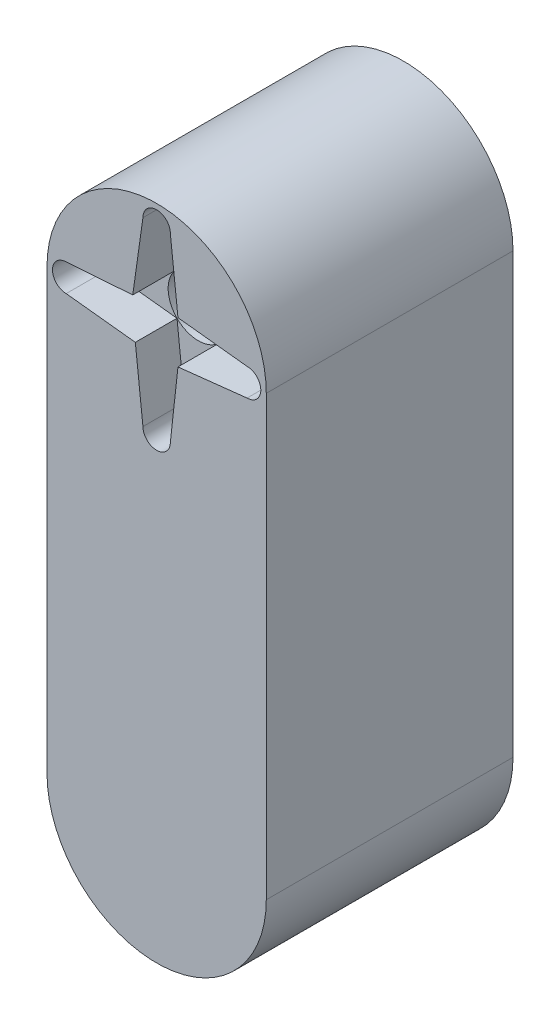
ISO-10303-21;
HEADER;
FILE_DESCRIPTION(('STEP AP214'),'2;1');
FILE_NAME('part.step','',(''),(''),'','','');
FILE_SCHEMA(('AUTOMOTIVE_DESIGN { 1 0 10303 214 1 1 1 1 }'));
ENDSEC;
DATA;
#1=APPLICATION_CONTEXT('core data for automotive mechanical design processes');
#2=APPLICATION_PROTOCOL_DEFINITION('international standard','automotive_design',2000,#1);
#3=PRODUCT_CONTEXT('',#1,'mechanical');
#4=PRODUCT('Part','Part','',(#3));
#5=PRODUCT_RELATED_PRODUCT_CATEGORY('part','',(#4));
#6=PRODUCT_DEFINITION_FORMATION('','',#4);
#7=PRODUCT_DEFINITION_CONTEXT('part definition',#1,'design');
#8=PRODUCT_DEFINITION('design','',#6,#7);
#9=PRODUCT_DEFINITION_SHAPE('','',#8);
#10=(LENGTH_UNIT() NAMED_UNIT(*) SI_UNIT(.MILLI.,.METRE.));
#11=(NAMED_UNIT(*) PLANE_ANGLE_UNIT() SI_UNIT($,.RADIAN.));
#12=(NAMED_UNIT(*) SI_UNIT($,.STERADIAN.) SOLID_ANGLE_UNIT());
#13=UNCERTAINTY_MEASURE_WITH_UNIT(LENGTH_MEASURE(1.E-05),#10,'distance_accuracy_value','');
#14=(GEOMETRIC_REPRESENTATION_CONTEXT(3) GLOBAL_UNCERTAINTY_ASSIGNED_CONTEXT((#13)) GLOBAL_UNIT_ASSIGNED_CONTEXT((#10,
#11,#12)) REPRESENTATION_CONTEXT('',''));
#15=CARTESIAN_POINT('',(0.,0.,0.));
#16=DIRECTION('',(0.,0.,1.));
#17=DIRECTION('',(1.,0.,0.));
#18=AXIS2_PLACEMENT_3D('',#15,#16,#17);
#19=CARTESIAN_POINT('',(10.,-50.,40.));
#20=DIRECTION('',(0.,-1.,0.));
#21=DIRECTION('',(0.,0.,-1.));
#22=AXIS2_PLACEMENT_3D('',#19,#20,#21);
#23=PLANE('',#22);
#24=DIRECTION('',(1.,0.,0.));
#25=VECTOR('',#24,1.);
#26=CARTESIAN_POINT('',(-10.,-50.,27.));
#27=LINE('',#26,#25);
#28=CARTESIAN_POINT('',(-10.,-50.,27.));
#29=VERTEX_POINT('',#28);
#30=CARTESIAN_POINT('',(10.,-50.,27.));
#31=VERTEX_POINT('',#30);
#32=EDGE_CURVE('E699',#29,#31,#27,.T.);
#33=ORIENTED_EDGE('',*,*,#32,.T.);
#34=DIRECTION('',(0.,0.,-1.));
#35=VECTOR('',#34,1.);
#36=CARTESIAN_POINT('',(10.,-50.,40.));
#37=LINE('',#36,#35);
#38=CARTESIAN_POINT('',(10.,-50.,12.));
#39=VERTEX_POINT('',#38);
#40=EDGE_CURVE('E269',#31,#39,#37,.T.);
#41=ORIENTED_EDGE('',*,*,#40,.T.);
#42=DIRECTION('',(1.,0.,0.));
#43=VECTOR('',#42,1.);
#44=CARTESIAN_POINT('',(-10.,-50.,12.));
#45=LINE('',#44,#43);
#46=CARTESIAN_POINT('',(-10.,-50.,12.));
#47=VERTEX_POINT('',#46);
#48=EDGE_CURVE('E640',#47,#39,#45,.T.);
#49=ORIENTED_EDGE('',*,*,#48,.F.);
#50=DIRECTION('',(0.,0.,-1.));
#51=VECTOR('',#50,1.);
#52=CARTESIAN_POINT('',(-10.,-50.,40.));
#53=LINE('',#52,#51);
#54=EDGE_CURVE('E256',#29,#47,#53,.T.);
#55=ORIENTED_EDGE('',*,*,#54,.F.);
#56=EDGE_LOOP('',(#33,#41,#49,#55));
#57=FACE_BOUND('',#56,.T.);
#58=ADVANCED_FACE('F45',(#57),#23,.F.);
#59=CARTESIAN_POINT('',(-16.5,40.,37.4));
#60=DIRECTION('',(0.,0.,1.));
#61=DIRECTION('',(1.,0.,0.));
#62=AXIS2_PLACEMENT_3D('',#59,#60,#61);
#63=PLANE('',#62);
#64=CARTESIAN_POINT('',(0.,40.,37.4));
#65=DIRECTION('',(0.,0.,1.));
#66=DIRECTION('',(1.,0.,0.));
#67=AXIS2_PLACEMENT_3D('',#64,#65,#66);
#68=CIRCLE('',#67,5.5);
#69=CARTESIAN_POINT('',(3.88908729652601,43.889087296526,37.4));
#70=VERTEX_POINT('',#69);
#71=CARTESIAN_POINT('',(-4.35596230646489,43.3579148864522,37.4));
#72=VERTEX_POINT('',#71);
#73=EDGE_CURVE('E11',#70,#72,#68,.T.);
#74=ORIENTED_EDGE('',*,*,#73,.F.);
#75=DIRECTION('',(-0.109487424700767,0.993988180931943,0.));
#76=VECTOR('',#75,1.);
#77=CARTESIAN_POINT('',(2.5,56.5,37.4));
#78=LINE('',#77,#76);
#79=CARTESIAN_POINT('',(2.5,56.5,37.4));
#80=VERTEX_POINT('',#79);
#81=EDGE_CURVE('E312',#70,#80,#78,.T.);
#82=ORIENTED_EDGE('',*,*,#81,.T.);
#83=CARTESIAN_POINT('',(0.,56.5,37.4));
#84=DIRECTION('',(0.,0.,1.));
#85=DIRECTION('',(1.,0.,0.));
#86=AXIS2_PLACEMENT_3D('',#83,#84,#85);
#87=CIRCLE('',#86,2.5);
#88=CARTESIAN_POINT('',(-2.5,56.5,37.4));
#89=VERTEX_POINT('',#88);
#90=EDGE_CURVE('E316',#80,#89,#87,.T.);
#91=ORIENTED_EDGE('',*,*,#90,.T.);
#92=DIRECTION('',(-0.139835273763505,-0.990174780637987,0.));
#93=VECTOR('',#92,1.);
#94=CARTESIAN_POINT('',(-2.5,56.5,37.4));
#95=LINE('',#94,#93);
#96=EDGE_CURVE('E320',#89,#72,#95,.T.);
#97=ORIENTED_EDGE('',*,*,#96,.T.);
#98=EDGE_LOOP('',(#74,#82,#91,#97));
#99=FACE_BOUND('',#98,.T.);
#100=ADVANCED_FACE('F485',(#99),#63,.T.);
#101=CARTESIAN_POINT('',(-3.88908729652601,36.110912703474,37.4));
#102=VERTEX_POINT('',#101);
#103=EDGE_CURVE('E55',#72,#102,#68,.T.);
#104=ORIENTED_EDGE('',*,*,#103,.F.);
#105=DIRECTION('',(-0.997513947318562,-0.0704693188908521,0.));
#106=VECTOR('',#105,1.);
#107=CARTESIAN_POINT('',(-16.5,42.5,37.4));
#108=LINE('',#107,#106);
#109=CARTESIAN_POINT('',(-16.5,42.5,37.4));
#110=VERTEX_POINT('',#109);
#111=EDGE_CURVE('E324',#72,#110,#108,.T.);
#112=ORIENTED_EDGE('',*,*,#111,.T.);
#113=CARTESIAN_POINT('',(-16.5,40.,37.4));
#114=DIRECTION('',(0.,0.,1.));
#115=DIRECTION('',(1.,0.,0.));
#116=AXIS2_PLACEMENT_3D('',#113,#114,#115);
#117=CIRCLE('',#116,2.5);
#118=CARTESIAN_POINT('',(-16.5,37.5,37.4));
#119=VERTEX_POINT('',#118);
#120=EDGE_CURVE('E279',#110,#119,#117,.T.);
#121=ORIENTED_EDGE('',*,*,#120,.T.);
#122=DIRECTION('',(0.993988180931943,-0.109487424700767,0.));
#123=VECTOR('',#122,1.);
#124=CARTESIAN_POINT('',(-16.5,37.5,37.4));
#125=LINE('',#124,#123);
#126=EDGE_CURVE('E283',#119,#102,#125,.T.);
#127=ORIENTED_EDGE('',*,*,#126,.T.);
#128=EDGE_LOOP('',(#104,#112,#121,#127));
#129=FACE_BOUND('',#128,.T.);
#130=ADVANCED_FACE('F493',(#129),#63,.T.);
#131=CARTESIAN_POINT('',(3.88908729652601,36.110912703474,37.4));
#132=VERTEX_POINT('',#131);
#133=EDGE_CURVE('E597',#102,#132,#68,.T.);
#134=ORIENTED_EDGE('',*,*,#133,.F.);
#135=DIRECTION('',(0.109487424700768,-0.993988180931943,0.));
#136=VECTOR('',#135,1.);
#137=CARTESIAN_POINT('',(-2.5,23.5,37.4));
#138=LINE('',#137,#136);
#139=CARTESIAN_POINT('',(-2.5,23.5,37.4));
#140=VERTEX_POINT('',#139);
#141=EDGE_CURVE('E288',#102,#140,#138,.T.);
#142=ORIENTED_EDGE('',*,*,#141,.T.);
#143=CARTESIAN_POINT('',(0.,23.5,37.4));
#144=DIRECTION('',(0.,0.,1.));
#145=DIRECTION('',(1.,0.,0.));
#146=AXIS2_PLACEMENT_3D('',#143,#144,#145);
#147=CIRCLE('',#146,2.5);
#148=CARTESIAN_POINT('',(2.5,23.5,37.4));
#149=VERTEX_POINT('',#148);
#150=EDGE_CURVE('E292',#140,#149,#147,.T.);
#151=ORIENTED_EDGE('',*,*,#150,.T.);
#152=DIRECTION('',(0.109487424700767,0.993988180931943,0.));
#153=VECTOR('',#152,1.);
#154=CARTESIAN_POINT('',(3.88908729652601,36.110912703474,37.4));
#155=LINE('',#154,#153);
#156=EDGE_CURVE('E296',#149,#132,#155,.T.);
#157=ORIENTED_EDGE('',*,*,#156,.T.);
#158=EDGE_LOOP('',(#134,#142,#151,#157));
#159=FACE_BOUND('',#158,.T.);
#160=ADVANCED_FACE('F520',(#159),#63,.T.);
#161=CARTESIAN_POINT('',(0.,-40.,45.));
#162=DIRECTION('',(0.,0.,-1.));
#163=DIRECTION('',(-1.,0.,0.));
#164=AXIS2_PLACEMENT_3D('',#161,#162,#163);
#165=CYLINDRICAL_SURFACE('',#164,20.);
#166=DIRECTION('',(0.,0.,-1.));
#167=VECTOR('',#166,1.);
#168=CARTESIAN_POINT('',(-10.,-57.3205080756888,45.));
#169=LINE('',#168,#167);
#170=CARTESIAN_POINT('',(-10.,-57.3205080756888,27.));
#171=VERTEX_POINT('',#170);
#172=CARTESIAN_POINT('',(-10.,-57.3205080756888,39.));
#173=VERTEX_POINT('',#172);
#174=EDGE_CURVE('E657',#171,#173,#169,.F.);
#175=ORIENTED_EDGE('',*,*,#174,.T.);
#176=CARTESIAN_POINT('',(0.,-40.,39.));
#177=DIRECTION('',(0.,0.,1.));
#178=DIRECTION('',(1.,0.,0.));
#179=AXIS2_PLACEMENT_3D('',#176,#177,#178);
#180=CIRCLE('',#179,20.);
#181=CARTESIAN_POINT('',(10.,-57.3205080756888,39.));
#182=VERTEX_POINT('',#181);
#183=EDGE_CURVE('E233',#173,#182,#180,.T.);
#184=ORIENTED_EDGE('',*,*,#183,.T.);
#185=DIRECTION('',(0.,0.,-1.));
#186=VECTOR('',#185,1.);
#187=CARTESIAN_POINT('',(10.,-57.3205080756888,45.));
#188=LINE('',#187,#186);
#189=CARTESIAN_POINT('',(10.,-57.3205080756888,27.));
#190=VERTEX_POINT('',#189);
#191=EDGE_CURVE('E690',#182,#190,#188,.T.);
#192=ORIENTED_EDGE('',*,*,#191,.T.);
#193=CARTESIAN_POINT('',(0.,-40.,27.));
#194=DIRECTION('',(0.,0.,1.));
#195=DIRECTION('',(1.,0.,0.));
#196=AXIS2_PLACEMENT_3D('',#193,#194,#195);
#197=CIRCLE('',#196,20.);
#198=EDGE_CURVE('E692',#171,#190,#197,.T.);
#199=ORIENTED_EDGE('',*,*,#198,.F.);
#200=EDGE_LOOP('',(#175,#184,#192,#199));
#201=FACE_BOUND('',#200,.T.);
#202=CARTESIAN_POINT('',(0.,-40.,45.));
#203=DIRECTION('',(0.,0.,1.));
#204=DIRECTION('',(1.,0.,0.));
#205=AXIS2_PLACEMENT_3D('',#202,#203,#204);
#206=CIRCLE('',#205,20.);
#207=CARTESIAN_POINT('',(-20.,-40.,45.));
#208=VERTEX_POINT('',#207);
#209=CARTESIAN_POINT('',(20.,-40.,45.));
#210=VERTEX_POINT('',#209);
#211=EDGE_CURVE('E447',#208,#210,#206,.T.);
#212=ORIENTED_EDGE('',*,*,#211,.F.);
#213=DIRECTION('',(0.,0.,1.));
#214=VECTOR('',#213,1.);
#215=CARTESIAN_POINT('',(-20.,-40.,0.));
#216=LINE('',#215,#214);
#217=CARTESIAN_POINT('',(-20.,-40.,0.));
#218=VERTEX_POINT('',#217);
#219=EDGE_CURVE('E432',#218,#208,#216,.T.);
#220=ORIENTED_EDGE('',*,*,#219,.F.);
#221=CARTESIAN_POINT('',(0.,-40.,0.));
#222=DIRECTION('',(0.,0.,1.));
#223=DIRECTION('',(1.,0.,0.));
#224=AXIS2_PLACEMENT_3D('',#221,#222,#223);
#225=CIRCLE('',#224,20.);
#226=CARTESIAN_POINT('',(20.,-40.,0.));
#227=VERTEX_POINT('',#226);
#228=EDGE_CURVE('E436',#218,#227,#225,.T.);
#229=ORIENTED_EDGE('',*,*,#228,.T.);
#230=DIRECTION('',(0.,0.,1.));
#231=VECTOR('',#230,1.);
#232=CARTESIAN_POINT('',(20.,-40.,0.));
#233=LINE('',#232,#231);
#234=EDGE_CURVE('E426',#227,#210,#233,.T.);
#235=ORIENTED_EDGE('',*,*,#234,.T.);
#236=EDGE_LOOP('',(#212,#220,#229,#235));
#237=FACE_BOUND('',#236,.T.);
#238=ADVANCED_FACE('F47',(#201,#237),#165,.T.);
#239=CARTESIAN_POINT('',(0.,-40.,45.));
#240=DIRECTION('',(0.,0.,1.));
#241=DIRECTION('',(1.,0.,0.));
#242=AXIS2_PLACEMENT_3D('',#239,#240,#241);
#243=PLANE('',#242);
#244=CARTESIAN_POINT('',(-16.5,40.,45.));
#245=DIRECTION('',(0.,0.,1.));
#246=DIRECTION('',(1.,0.,0.));
#247=AXIS2_PLACEMENT_3D('',#244,#245,#246);
#248=CIRCLE('',#247,2.5);
#249=CARTESIAN_POINT('',(-16.5,42.5,45.));
#250=VERTEX_POINT('',#249);
#251=CARTESIAN_POINT('',(-16.5,37.5,45.));
#252=VERTEX_POINT('',#251);
#253=EDGE_CURVE('E261',#250,#252,#248,.T.);
#254=ORIENTED_EDGE('',*,*,#253,.F.);
#255=DIRECTION('',(-0.997513947318562,-0.0704693188908521,0.));
#256=VECTOR('',#255,1.);
#257=CARTESIAN_POINT('',(-16.5,42.5,45.));
#258=LINE('',#257,#256);
#259=CARTESIAN_POINT('',(-4.3559623064649,43.3579148864522,45.));
#260=VERTEX_POINT('',#259);
#261=EDGE_CURVE('E284',#260,#250,#258,.T.);
#262=ORIENTED_EDGE('',*,*,#261,.F.);
#263=DIRECTION('',(-0.139835273763505,-0.990174780637987,0.));
#264=VECTOR('',#263,1.);
#265=CARTESIAN_POINT('',(-2.5,56.5,45.));
#266=LINE('',#265,#264);
#267=CARTESIAN_POINT('',(-2.5,56.5,45.));
#268=VERTEX_POINT('',#267);
#269=EDGE_CURVE('E367',#268,#260,#266,.T.);
#270=ORIENTED_EDGE('',*,*,#269,.F.);
#271=CARTESIAN_POINT('',(0.,56.5,45.));
#272=DIRECTION('',(0.,0.,1.));
#273=DIRECTION('',(1.,0.,0.));
#274=AXIS2_PLACEMENT_3D('',#271,#272,#273);
#275=CIRCLE('',#274,2.5);
#276=CARTESIAN_POINT('',(2.5,56.5,45.));
#277=VERTEX_POINT('',#276);
#278=EDGE_CURVE('E363',#277,#268,#275,.T.);
#279=ORIENTED_EDGE('',*,*,#278,.F.);
#280=DIRECTION('',(-0.109487424700767,0.993988180931943,0.));
#281=VECTOR('',#280,1.);
#282=CARTESIAN_POINT('',(2.5,56.5,45.));
#283=LINE('',#282,#281);
#284=CARTESIAN_POINT('',(3.88908729652601,43.889087296526,45.));
#285=VERTEX_POINT('',#284);
#286=EDGE_CURVE('E359',#285,#277,#283,.T.);
#287=ORIENTED_EDGE('',*,*,#286,.F.);
#288=DIRECTION('',(-0.993988180931943,0.109487424700767,0.));
#289=VECTOR('',#288,1.);
#290=CARTESIAN_POINT('',(3.88908729652601,43.889087296526,45.));
#291=LINE('',#290,#289);
#292=CARTESIAN_POINT('',(16.5,42.5,45.));
#293=VERTEX_POINT('',#292);
#294=EDGE_CURVE('E355',#293,#285,#291,.T.);
#295=ORIENTED_EDGE('',*,*,#294,.F.);
#296=CARTESIAN_POINT('',(16.5,40.,45.));
#297=DIRECTION('',(0.,0.,1.));
#298=DIRECTION('',(1.,0.,0.));
#299=AXIS2_PLACEMENT_3D('',#296,#297,#298);
#300=CIRCLE('',#299,2.5);
#301=CARTESIAN_POINT('',(16.5,37.5,45.));
#302=VERTEX_POINT('',#301);
#303=EDGE_CURVE('E351',#302,#293,#300,.T.);
#304=ORIENTED_EDGE('',*,*,#303,.F.);
#305=DIRECTION('',(0.993988180931943,0.109487424700767,0.));
#306=VECTOR('',#305,1.);
#307=CARTESIAN_POINT('',(3.88908729652601,36.110912703474,45.));
#308=LINE('',#307,#306);
#309=CARTESIAN_POINT('',(3.88908729652601,36.110912703474,45.));
#310=VERTEX_POINT('',#309);
#311=EDGE_CURVE('E347',#310,#302,#308,.T.);
#312=ORIENTED_EDGE('',*,*,#311,.F.);
#313=DIRECTION('',(0.109487424700767,0.993988180931943,0.));
#314=VECTOR('',#313,1.);
#315=CARTESIAN_POINT('',(3.88908729652601,36.110912703474,45.));
#316=LINE('',#315,#314);
#317=CARTESIAN_POINT('',(2.5,23.5,45.));
#318=VERTEX_POINT('',#317);
#319=EDGE_CURVE('E343',#318,#310,#316,.T.);
#320=ORIENTED_EDGE('',*,*,#319,.F.);
#321=CARTESIAN_POINT('',(0.,23.5,45.));
#322=DIRECTION('',(0.,0.,1.));
#323=DIRECTION('',(1.,0.,0.));
#324=AXIS2_PLACEMENT_3D('',#321,#322,#323);
#325=CIRCLE('',#324,2.5);
#326=CARTESIAN_POINT('',(-2.5,23.5,45.));
#327=VERTEX_POINT('',#326);
#328=EDGE_CURVE('E339',#327,#318,#325,.T.);
#329=ORIENTED_EDGE('',*,*,#328,.F.);
#330=DIRECTION('',(0.109487424700768,-0.993988180931943,0.));
#331=VECTOR('',#330,1.);
#332=CARTESIAN_POINT('',(-2.5,23.5,45.));
#333=LINE('',#332,#331);
#334=CARTESIAN_POINT('',(-3.88908729652601,36.110912703474,45.));
#335=VERTEX_POINT('',#334);
#336=EDGE_CURVE('E335',#335,#327,#333,.T.);
#337=ORIENTED_EDGE('',*,*,#336,.F.);
#338=DIRECTION('',(0.993988180931943,-0.109487424700767,0.));
#339=VECTOR('',#338,1.);
#340=CARTESIAN_POINT('',(-16.5,37.5,45.));
#341=LINE('',#340,#339);
#342=EDGE_CURVE('E331',#252,#335,#341,.T.);
#343=ORIENTED_EDGE('',*,*,#342,.F.);
#344=EDGE_LOOP('',(#254,#262,#270,#279,#287,#295,#304,#312,#320,#329,#337,#343));
#345=FACE_BOUND('',#344,.T.);
#346=DIRECTION('',(0.,1.,0.));
#347=VECTOR('',#346,1.);
#348=CARTESIAN_POINT('',(20.,40.,45.));
#349=LINE('',#348,#347);
#350=CARTESIAN_POINT('',(20.,40.,45.));
#351=VERTEX_POINT('',#350);
#352=EDGE_CURVE('E414',#210,#351,#349,.T.);
#353=ORIENTED_EDGE('',*,*,#352,.T.);
#354=CARTESIAN_POINT('',(0.,40.,45.));
#355=DIRECTION('',(0.,0.,1.));
#356=DIRECTION('',(1.,0.,0.));
#357=AXIS2_PLACEMENT_3D('',#354,#355,#356);
#358=CIRCLE('',#357,20.);
#359=CARTESIAN_POINT('',(-20.,40.,45.));
#360=VERTEX_POINT('',#359);
#361=EDGE_CURVE('E377',#351,#360,#358,.T.);
#362=ORIENTED_EDGE('',*,*,#361,.T.);
#363=DIRECTION('',(0.,-1.,0.));
#364=VECTOR('',#363,1.);
#365=CARTESIAN_POINT('',(-20.,-40.,45.));
#366=LINE('',#365,#364);
#367=EDGE_CURVE('E423',#360,#208,#366,.T.);
#368=ORIENTED_EDGE('',*,*,#367,.T.);
#369=ORIENTED_EDGE('',*,*,#211,.T.);
#370=EDGE_LOOP('',(#353,#362,#368,#369));
#371=FACE_BOUND('',#370,.T.);
#372=ADVANCED_FACE('F464',(#345,#371),#243,.T.);
#373=CARTESIAN_POINT('',(0.,-40.,0.));
#374=DIRECTION('',(0.,0.,1.));
#375=DIRECTION('',(1.,0.,0.));
#376=AXIS2_PLACEMENT_3D('',#373,#374,#375);
#377=PLANE('',#376);
#378=DIRECTION('',(0.,1.,0.));
#379=VECTOR('',#378,1.);
#380=CARTESIAN_POINT('',(-10.,-50.,0.));
#381=LINE('',#380,#379);
#382=CARTESIAN_POINT('',(-10.,-56.5,0.));
#383=VERTEX_POINT('',#382);
#384=CARTESIAN_POINT('',(-9.99999999999999,-3.,0.));
#385=VERTEX_POINT('',#384);
#386=EDGE_CURVE('E616',#383,#385,#381,.T.);
#387=ORIENTED_EDGE('',*,*,#386,.F.);
#388=DIRECTION('',(-1.,0.,0.));
#389=VECTOR('',#388,1.);
#390=CARTESIAN_POINT('',(-10.,-56.5,0.));
#391=LINE('',#390,#389);
#392=CARTESIAN_POINT('',(10.,-56.5,0.));
#393=VERTEX_POINT('',#392);
#394=EDGE_CURVE('E619',#393,#383,#391,.T.);
#395=ORIENTED_EDGE('',*,*,#394,.F.);
#396=DIRECTION('',(0.,-1.,0.));
#397=VECTOR('',#396,1.);
#398=CARTESIAN_POINT('',(10.,-10.,0.));
#399=LINE('',#398,#397);
#400=CARTESIAN_POINT('',(10.,-3.,0.));
#401=VERTEX_POINT('',#400);
#402=EDGE_CURVE('E265',#401,#393,#399,.T.);
#403=ORIENTED_EDGE('',*,*,#402,.F.);
#404=DIRECTION('',(1.,0.,0.));
#405=VECTOR('',#404,1.);
#406=CARTESIAN_POINT('',(10.,-3.,0.));
#407=LINE('',#406,#405);
#408=EDGE_CURVE('E621',#385,#401,#407,.T.);
#409=ORIENTED_EDGE('',*,*,#408,.F.);
#410=EDGE_LOOP('',(#387,#395,#403,#409));
#411=FACE_BOUND('',#410,.T.);
#412=CARTESIAN_POINT('',(0.,40.,0.));
#413=DIRECTION('',(0.,0.,1.));
#414=DIRECTION('',(1.,0.,0.));
#415=AXIS2_PLACEMENT_3D('',#412,#413,#414);
#416=CIRCLE('',#415,5.5);
#417=CARTESIAN_POINT('',(5.5,40.,0.));
#418=VERTEX_POINT('',#417);
#419=EDGE_CURVE('E255',#418,#418,#416,.T.);
#420=ORIENTED_EDGE('',*,*,#419,.T.);
#421=EDGE_LOOP('',(#420));
#422=FACE_BOUND('',#421,.T.);
#423=DIRECTION('',(0.,-1.,0.));
#424=VECTOR('',#423,1.);
#425=CARTESIAN_POINT('',(-20.,-40.,0.));
#426=LINE('',#425,#424);
#427=CARTESIAN_POINT('',(-20.,40.,0.));
#428=VERTEX_POINT('',#427);
#429=EDGE_CURVE('E422',#428,#218,#426,.T.);
#430=ORIENTED_EDGE('',*,*,#429,.F.);
#431=CARTESIAN_POINT('',(0.,40.,0.));
#432=DIRECTION('',(0.,0.,1.));
#433=DIRECTION('',(1.,0.,0.));
#434=AXIS2_PLACEMENT_3D('',#431,#432,#433);
#435=CIRCLE('',#434,20.);
#436=CARTESIAN_POINT('',(20.,40.,0.));
#437=VERTEX_POINT('',#436);
#438=EDGE_CURVE('E411',#437,#428,#435,.T.);
#439=ORIENTED_EDGE('',*,*,#438,.F.);
#440=DIRECTION('',(0.,1.,0.));
#441=VECTOR('',#440,1.);
#442=CARTESIAN_POINT('',(20.,40.,0.));
#443=LINE('',#442,#441);
#444=EDGE_CURVE('E418',#227,#437,#443,.T.);
#445=ORIENTED_EDGE('',*,*,#444,.F.);
#446=ORIENTED_EDGE('',*,*,#228,.F.);
#447=EDGE_LOOP('',(#430,#439,#445,#446));
#448=FACE_BOUND('',#447,.T.);
#449=ADVANCED_FACE('F459',(#411,#422,#448),#377,.F.);
#450=CARTESIAN_POINT('',(-20.,-40.,0.));
#451=DIRECTION('',(-1.,0.,0.));
#452=DIRECTION('',(0.,-1.,0.));
#453=AXIS2_PLACEMENT_3D('',#450,#451,#452);
#454=PLANE('',#453);
#455=ORIENTED_EDGE('',*,*,#367,.F.);
#456=DIRECTION('',(0.,0.,1.));
#457=VECTOR('',#456,1.);
#458=CARTESIAN_POINT('',(-20.,40.,0.));
#459=LINE('',#458,#457);
#460=EDGE_CURVE('E437',#428,#360,#459,.T.);
#461=ORIENTED_EDGE('',*,*,#460,.F.);
#462=ORIENTED_EDGE('',*,*,#429,.T.);
#463=ORIENTED_EDGE('',*,*,#219,.T.);
#464=EDGE_LOOP('',(#455,#461,#462,#463));
#465=FACE_BOUND('',#464,.T.);
#466=ADVANCED_FACE('F468',(#465),#454,.T.);
#467=CARTESIAN_POINT('',(20.,40.,0.));
#468=DIRECTION('',(1.,0.,0.));
#469=DIRECTION('',(0.,1.,0.));
#470=AXIS2_PLACEMENT_3D('',#467,#468,#469);
#471=PLANE('',#470);
#472=ORIENTED_EDGE('',*,*,#352,.F.);
#473=ORIENTED_EDGE('',*,*,#234,.F.);
#474=ORIENTED_EDGE('',*,*,#444,.T.);
#475=DIRECTION('',(0.,0.,1.));
#476=VECTOR('',#475,1.);
#477=CARTESIAN_POINT('',(20.,40.,0.));
#478=LINE('',#477,#476);
#479=EDGE_CURVE('E440',#437,#351,#478,.T.);
#480=ORIENTED_EDGE('',*,*,#479,.T.);
#481=EDGE_LOOP('',(#472,#473,#474,#480));
#482=FACE_BOUND('',#481,.T.);
#483=ADVANCED_FACE('F462',(#482),#471,.T.);
#484=CARTESIAN_POINT('',(0.,40.,45.));
#485=DIRECTION('',(0.,0.,-1.));
#486=DIRECTION('',(-1.,0.,0.));
#487=AXIS2_PLACEMENT_3D('',#484,#485,#486);
#488=CYLINDRICAL_SURFACE('',#487,20.);
#489=ORIENTED_EDGE('',*,*,#460,.T.);
#490=ORIENTED_EDGE('',*,*,#361,.F.);
#491=ORIENTED_EDGE('',*,*,#479,.F.);
#492=ORIENTED_EDGE('',*,*,#438,.T.);
#493=EDGE_LOOP('',(#489,#490,#491,#492));
#494=FACE_BOUND('',#493,.T.);
#495=ADVANCED_FACE('F470',(#494),#488,.T.);
#496=CARTESIAN_POINT('',(-16.5,40.,37.4));
#497=DIRECTION('',(0.,0.,1.));
#498=DIRECTION('',(1.,0.,0.));
#499=AXIS2_PLACEMENT_3D('',#496,#497,#498);
#500=CYLINDRICAL_SURFACE('',#499,2.5);
#501=ORIENTED_EDGE('',*,*,#253,.T.);
#502=DIRECTION('',(0.,0.,1.));
#503=VECTOR('',#502,1.);
#504=CARTESIAN_POINT('',(-16.5,37.5,37.4));
#505=LINE('',#504,#503);
#506=EDGE_CURVE('E328',#119,#252,#505,.T.);
#507=ORIENTED_EDGE('',*,*,#506,.F.);
#508=ORIENTED_EDGE('',*,*,#120,.F.);
#509=DIRECTION('',(0.,0.,1.));
#510=VECTOR('',#509,1.);
#511=CARTESIAN_POINT('',(-16.5,42.5,37.4));
#512=LINE('',#511,#510);
#513=EDGE_CURVE('E374',#110,#250,#512,.T.);
#514=ORIENTED_EDGE('',*,*,#513,.T.);
#515=EDGE_LOOP('',(#501,#507,#508,#514));
#516=FACE_BOUND('',#515,.T.);
#517=ADVANCED_FACE('F472',(#516),#500,.F.);
#518=CARTESIAN_POINT('',(-16.5,42.5,37.4));
#519=DIRECTION('',(-0.0704693188908521,0.997513947318562,0.));
#520=DIRECTION('',(-0.997513947318562,-0.0704693188908521,0.));
#521=AXIS2_PLACEMENT_3D('',#518,#519,#520);
#522=PLANE('',#521);
#523=ORIENTED_EDGE('',*,*,#261,.T.);
#524=ORIENTED_EDGE('',*,*,#513,.F.);
#525=ORIENTED_EDGE('',*,*,#111,.F.);
#526=DIRECTION('',(0.,0.,1.));
#527=VECTOR('',#526,1.);
#528=CARTESIAN_POINT('',(-4.3559623064649,43.3579148864522,37.4));
#529=LINE('',#528,#527);
#530=EDGE_CURVE('E378',#72,#260,#529,.T.);
#531=ORIENTED_EDGE('',*,*,#530,.T.);
#532=EDGE_LOOP('',(#523,#524,#525,#531));
#533=FACE_BOUND('',#532,.T.);
#534=ADVANCED_FACE('F479',(#533),#522,.F.);
#535=CARTESIAN_POINT('',(-2.5,56.5,37.4));
#536=DIRECTION('',(-0.990174780637987,0.139835273763505,0.));
#537=DIRECTION('',(-0.139835273763505,-0.990174780637987,0.));
#538=AXIS2_PLACEMENT_3D('',#535,#536,#537);
#539=PLANE('',#538);
#540=ORIENTED_EDGE('',*,*,#269,.T.);
#541=ORIENTED_EDGE('',*,*,#530,.F.);
#542=ORIENTED_EDGE('',*,*,#96,.F.);
#543=DIRECTION('',(0.,0.,1.));
#544=VECTOR('',#543,1.);
#545=CARTESIAN_POINT('',(-2.5,56.5,37.4));
#546=LINE('',#545,#544);
#547=EDGE_CURVE('E381',#89,#268,#546,.T.);
#548=ORIENTED_EDGE('',*,*,#547,.T.);
#549=EDGE_LOOP('',(#540,#541,#542,#548));
#550=FACE_BOUND('',#549,.T.);
#551=ADVANCED_FACE('F523',(#550),#539,.F.);
#552=CARTESIAN_POINT('',(0.,56.5,37.4));
#553=DIRECTION('',(0.,0.,1.));
#554=DIRECTION('',(1.,0.,0.));
#555=AXIS2_PLACEMENT_3D('',#552,#553,#554);
#556=CYLINDRICAL_SURFACE('',#555,2.5);
#557=ORIENTED_EDGE('',*,*,#278,.T.);
#558=ORIENTED_EDGE('',*,*,#547,.F.);
#559=ORIENTED_EDGE('',*,*,#90,.F.);
#560=DIRECTION('',(0.,0.,1.));
#561=VECTOR('',#560,1.);
#562=CARTESIAN_POINT('',(2.5,56.5,37.4));
#563=LINE('',#562,#561);
#564=EDGE_CURVE('E384',#80,#277,#563,.T.);
#565=ORIENTED_EDGE('',*,*,#564,.T.);
#566=EDGE_LOOP('',(#557,#558,#559,#565));
#567=FACE_BOUND('',#566,.T.);
#568=ADVANCED_FACE('F527',(#567),#556,.F.);
#569=CARTESIAN_POINT('',(2.5,56.5,37.4));
#570=DIRECTION('',(0.993988180931943,0.109487424700767,0.));
#571=DIRECTION('',(-0.109487424700767,0.993988180931944,0.));
#572=AXIS2_PLACEMENT_3D('',#569,#570,#571);
#573=PLANE('',#572);
#574=ORIENTED_EDGE('',*,*,#286,.T.);
#575=ORIENTED_EDGE('',*,*,#564,.F.);
#576=ORIENTED_EDGE('',*,*,#81,.F.);
#577=DIRECTION('',(0.,0.,1.));
#578=VECTOR('',#577,1.);
#579=CARTESIAN_POINT('',(3.88908729652601,43.889087296526,37.4));
#580=LINE('',#579,#578);
#581=EDGE_CURVE('E387',#70,#285,#580,.T.);
#582=ORIENTED_EDGE('',*,*,#581,.T.);
#583=EDGE_LOOP('',(#574,#575,#576,#582));
#584=FACE_BOUND('',#583,.T.);
#585=ADVANCED_FACE('F531',(#584),#573,.F.);
#586=CARTESIAN_POINT('',(3.88908729652601,43.889087296526,37.4));
#587=DIRECTION('',(0.109487424700767,0.993988180931943,0.));
#588=DIRECTION('',(-0.993988180931943,0.109487424700767,0.));
#589=AXIS2_PLACEMENT_3D('',#586,#587,#588);
#590=PLANE('',#589);
#591=ORIENTED_EDGE('',*,*,#294,.T.);
#592=ORIENTED_EDGE('',*,*,#581,.F.);
#593=DIRECTION('',(-0.993988180931943,0.109487424700767,0.));
#594=VECTOR('',#593,1.);
#595=CARTESIAN_POINT('',(3.88908729652601,43.889087296526,37.4));
#596=LINE('',#595,#594);
#597=CARTESIAN_POINT('',(16.5,42.5,37.4));
#598=VERTEX_POINT('',#597);
#599=EDGE_CURVE('E308',#598,#70,#596,.T.);
#600=ORIENTED_EDGE('',*,*,#599,.F.);
#601=DIRECTION('',(0.,0.,1.));
#602=VECTOR('',#601,1.);
#603=CARTESIAN_POINT('',(16.5,42.5,37.4));
#604=LINE('',#603,#602);
#605=EDGE_CURVE('E390',#598,#293,#604,.T.);
#606=ORIENTED_EDGE('',*,*,#605,.T.);
#607=EDGE_LOOP('',(#591,#592,#600,#606));
#608=FACE_BOUND('',#607,.T.);
#609=ADVANCED_FACE('F535',(#608),#590,.F.);
#610=CARTESIAN_POINT('',(16.5,40.,37.4));
#611=DIRECTION('',(0.,0.,1.));
#612=DIRECTION('',(1.,0.,0.));
#613=AXIS2_PLACEMENT_3D('',#610,#611,#612);
#614=CYLINDRICAL_SURFACE('',#613,2.5);
#615=ORIENTED_EDGE('',*,*,#303,.T.);
#616=ORIENTED_EDGE('',*,*,#605,.F.);
#617=CARTESIAN_POINT('',(16.5,40.,37.4));
#618=DIRECTION('',(0.,0.,1.));
#619=DIRECTION('',(1.,0.,0.));
#620=AXIS2_PLACEMENT_3D('',#617,#618,#619);
#621=CIRCLE('',#620,2.5);
#622=CARTESIAN_POINT('',(16.5,37.5,37.4));
#623=VERTEX_POINT('',#622);
#624=EDGE_CURVE('E304',#623,#598,#621,.T.);
#625=ORIENTED_EDGE('',*,*,#624,.F.);
#626=DIRECTION('',(0.,0.,1.));
#627=VECTOR('',#626,1.);
#628=CARTESIAN_POINT('',(16.5,37.5,37.4));
#629=LINE('',#628,#627);
#630=EDGE_CURVE('E393',#623,#302,#629,.T.);
#631=ORIENTED_EDGE('',*,*,#630,.T.);
#632=EDGE_LOOP('',(#615,#616,#625,#631));
#633=FACE_BOUND('',#632,.T.);
#634=ADVANCED_FACE('F539',(#633),#614,.F.);
#635=CARTESIAN_POINT('',(3.88908729652601,36.110912703474,37.4));
#636=DIRECTION('',(0.109487424700767,-0.993988180931943,0.));
#637=DIRECTION('',(0.993988180931944,0.109487424700767,0.));
#638=AXIS2_PLACEMENT_3D('',#635,#636,#637);
#639=PLANE('',#638);
#640=ORIENTED_EDGE('',*,*,#311,.T.);
#641=ORIENTED_EDGE('',*,*,#630,.F.);
#642=DIRECTION('',(0.993988180931943,0.109487424700767,0.));
#643=VECTOR('',#642,1.);
#644=CARTESIAN_POINT('',(3.88908729652601,36.110912703474,37.4));
#645=LINE('',#644,#643);
#646=EDGE_CURVE('E300',#132,#623,#645,.T.);
#647=ORIENTED_EDGE('',*,*,#646,.F.);
#648=DIRECTION('',(0.,0.,1.));
#649=VECTOR('',#648,1.);
#650=CARTESIAN_POINT('',(3.88908729652601,36.110912703474,37.4));
#651=LINE('',#650,#649);
#652=EDGE_CURVE('E396',#132,#310,#651,.T.);
#653=ORIENTED_EDGE('',*,*,#652,.T.);
#654=EDGE_LOOP('',(#640,#641,#647,#653));
#655=FACE_BOUND('',#654,.T.);
#656=ADVANCED_FACE('F543',(#655),#639,.F.);
#657=CARTESIAN_POINT('',(3.88908729652601,36.110912703474,37.4));
#658=DIRECTION('',(0.993988180931943,-0.109487424700767,0.));
#659=DIRECTION('',(0.109487424700767,0.993988180931944,0.));
#660=AXIS2_PLACEMENT_3D('',#657,#658,#659);
#661=PLANE('',#660);
#662=ORIENTED_EDGE('',*,*,#319,.T.);
#663=ORIENTED_EDGE('',*,*,#652,.F.);
#664=ORIENTED_EDGE('',*,*,#156,.F.);
#665=DIRECTION('',(0.,0.,1.));
#666=VECTOR('',#665,1.);
#667=CARTESIAN_POINT('',(2.5,23.5,37.4));
#668=LINE('',#667,#666);
#669=EDGE_CURVE('E399',#149,#318,#668,.T.);
#670=ORIENTED_EDGE('',*,*,#669,.T.);
#671=EDGE_LOOP('',(#662,#663,#664,#670));
#672=FACE_BOUND('',#671,.T.);
#673=ADVANCED_FACE('F547',(#672),#661,.F.);
#674=CARTESIAN_POINT('',(0.,23.5,37.4));
#675=DIRECTION('',(0.,0.,1.));
#676=DIRECTION('',(1.,0.,0.));
#677=AXIS2_PLACEMENT_3D('',#674,#675,#676);
#678=CYLINDRICAL_SURFACE('',#677,2.5);
#679=ORIENTED_EDGE('',*,*,#328,.T.);
#680=ORIENTED_EDGE('',*,*,#669,.F.);
#681=ORIENTED_EDGE('',*,*,#150,.F.);
#682=DIRECTION('',(0.,0.,1.));
#683=VECTOR('',#682,1.);
#684=CARTESIAN_POINT('',(-2.5,23.5,37.4));
#685=LINE('',#684,#683);
#686=EDGE_CURVE('E402',#140,#327,#685,.T.);
#687=ORIENTED_EDGE('',*,*,#686,.T.);
#688=EDGE_LOOP('',(#679,#680,#681,#687));
#689=FACE_BOUND('',#688,.T.);
#690=ADVANCED_FACE('F551',(#689),#678,.F.);
#691=CARTESIAN_POINT('',(-2.5,23.5,37.4));
#692=DIRECTION('',(-0.993988180931943,-0.109487424700768,0.));
#693=DIRECTION('',(0.109487424700768,-0.993988180931943,0.));
#694=AXIS2_PLACEMENT_3D('',#691,#692,#693);
#695=PLANE('',#694);
#696=ORIENTED_EDGE('',*,*,#336,.T.);
#697=ORIENTED_EDGE('',*,*,#686,.F.);
#698=ORIENTED_EDGE('',*,*,#141,.F.);
#699=DIRECTION('',(0.,0.,1.));
#700=VECTOR('',#699,1.);
#701=CARTESIAN_POINT('',(-3.88908729652601,36.110912703474,37.4));
#702=LINE('',#701,#700);
#703=EDGE_CURVE('E405',#102,#335,#702,.T.);
#704=ORIENTED_EDGE('',*,*,#703,.T.);
#705=EDGE_LOOP('',(#696,#697,#698,#704));
#706=FACE_BOUND('',#705,.T.);
#707=ADVANCED_FACE('F555',(#706),#695,.F.);
#708=CARTESIAN_POINT('',(-16.5,37.5,37.4));
#709=DIRECTION('',(-0.109487424700767,-0.993988180931943,0.));
#710=DIRECTION('',(0.993988180931944,-0.109487424700767,0.));
#711=AXIS2_PLACEMENT_3D('',#708,#709,#710);
#712=PLANE('',#711);
#713=ORIENTED_EDGE('',*,*,#342,.T.);
#714=ORIENTED_EDGE('',*,*,#703,.F.);
#715=ORIENTED_EDGE('',*,*,#126,.F.);
#716=ORIENTED_EDGE('',*,*,#506,.T.);
#717=EDGE_LOOP('',(#713,#714,#715,#716));
#718=FACE_BOUND('',#717,.T.);
#719=ADVANCED_FACE('F518',(#718),#712,.F.);
#720=EDGE_CURVE('E49',#132,#70,#68,.T.);
#721=ORIENTED_EDGE('',*,*,#720,.F.);
#722=ORIENTED_EDGE('',*,*,#646,.T.);
#723=ORIENTED_EDGE('',*,*,#624,.T.);
#724=ORIENTED_EDGE('',*,*,#599,.T.);
#725=EDGE_LOOP('',(#721,#722,#723,#724));
#726=FACE_BOUND('',#725,.T.);
#727=ADVANCED_FACE('F496',(#726),#63,.T.);
#728=CARTESIAN_POINT('',(0.,40.,-5.));
#729=DIRECTION('',(0.,0.,1.));
#730=DIRECTION('',(1.,0.,0.));
#731=AXIS2_PLACEMENT_3D('',#728,#729,#730);
#732=CYLINDRICAL_SURFACE('',#731,5.5);
#733=ORIENTED_EDGE('',*,*,#73,.T.);
#734=ORIENTED_EDGE('',*,*,#103,.T.);
#735=ORIENTED_EDGE('',*,*,#133,.T.);
#736=ORIENTED_EDGE('',*,*,#720,.T.);
#737=EDGE_LOOP('',(#733,#734,#735,#736));
#738=FACE_BOUND('',#737,.T.);
#739=ORIENTED_EDGE('',*,*,#419,.F.);
#740=EDGE_LOOP('',(#739));
#741=FACE_BOUND('',#740,.T.);
#742=ADVANCED_FACE('F508',(#738,#741),#732,.F.);
#743=CARTESIAN_POINT('',(-10.,-50.,40.));
#744=DIRECTION('',(-1.,0.,0.));
#745=DIRECTION('',(0.,-1.,0.));
#746=AXIS2_PLACEMENT_3D('',#743,#744,#745);
#747=PLANE('',#746);
#748=ORIENTED_EDGE('',*,*,#386,.T.);
#749=DIRECTION('',(0.,0.,-1.));
#750=VECTOR('',#749,1.);
#751=CARTESIAN_POINT('',(-9.99999999999999,-3.,12.));
#752=LINE('',#751,#750);
#753=CARTESIAN_POINT('',(-9.99999999999999,-3.,12.));
#754=VERTEX_POINT('',#753);
#755=EDGE_CURVE('E650',#754,#385,#752,.T.);
#756=ORIENTED_EDGE('',*,*,#755,.F.);
#757=DIRECTION('',(0.,1.,0.));
#758=VECTOR('',#757,1.);
#759=CARTESIAN_POINT('',(-9.99999999999999,-10.,12.));
#760=LINE('',#759,#758);
#761=CARTESIAN_POINT('',(-9.99999999999999,-10.,12.));
#762=VERTEX_POINT('',#761);
#763=EDGE_CURVE('E662',#762,#754,#760,.T.);
#764=ORIENTED_EDGE('',*,*,#763,.F.);
#765=DIRECTION('',(0.,0.,-1.));
#766=VECTOR('',#765,1.);
#767=CARTESIAN_POINT('',(-9.99999999999999,-10.,40.));
#768=LINE('',#767,#766);
#769=CARTESIAN_POINT('',(-9.99999999999999,-10.,40.));
#770=VERTEX_POINT('',#769);
#771=EDGE_CURVE('E274',#770,#762,#768,.T.);
#772=ORIENTED_EDGE('',*,*,#771,.F.);
#773=DIRECTION('',(0.,1.,0.));
#774=VECTOR('',#773,1.);
#775=CARTESIAN_POINT('',(-10.,-50.,40.));
#776=LINE('',#775,#774);
#777=CARTESIAN_POINT('',(-10.,-50.,40.));
#778=VERTEX_POINT('',#777);
#779=EDGE_CURVE('E252',#778,#770,#776,.T.);
#780=ORIENTED_EDGE('',*,*,#779,.F.);
#781=CARTESIAN_POINT('',(-10.,-50.,39.));
#782=VERTEX_POINT('',#781);
#783=EDGE_CURVE('E244',#778,#782,#53,.T.);
#784=ORIENTED_EDGE('',*,*,#783,.T.);
#785=DIRECTION('',(0.,1.,0.));
#786=VECTOR('',#785,1.);
#787=CARTESIAN_POINT('',(-10.,-50.,39.));
#788=LINE('',#787,#786);
#789=EDGE_CURVE('E230',#173,#782,#788,.T.);
#790=ORIENTED_EDGE('',*,*,#789,.F.);
#791=ORIENTED_EDGE('',*,*,#174,.F.);
#792=DIRECTION('',(0.,1.,0.));
#793=VECTOR('',#792,1.);
#794=CARTESIAN_POINT('',(-10.,-50.,27.));
#795=LINE('',#794,#793);
#796=EDGE_CURVE('E62',#171,#29,#795,.T.);
#797=ORIENTED_EDGE('',*,*,#796,.T.);
#798=ORIENTED_EDGE('',*,*,#54,.T.);
#799=DIRECTION('',(0.,1.,0.));
#800=VECTOR('',#799,1.);
#801=CARTESIAN_POINT('',(-10.,-50.,12.));
#802=LINE('',#801,#800);
#803=CARTESIAN_POINT('',(-10.,-56.5,12.));
#804=VERTEX_POINT('',#803);
#805=EDGE_CURVE('E627',#804,#47,#802,.T.);
#806=ORIENTED_EDGE('',*,*,#805,.F.);
#807=DIRECTION('',(0.,0.,-1.));
#808=VECTOR('',#807,1.);
#809=CARTESIAN_POINT('',(-10.,-56.5,12.));
#810=LINE('',#809,#808);
#811=EDGE_CURVE('E624',#804,#383,#810,.T.);
#812=ORIENTED_EDGE('',*,*,#811,.T.);
#813=EDGE_LOOP('',(#748,#756,#764,#772,#780,#784,#790,#791,#797,#798,#806,#812));
#814=FACE_BOUND('',#813,.T.);
#815=ADVANCED_FACE('F250',(#814),#747,.F.);
#816=CARTESIAN_POINT('',(10.,-50.,40.));
#817=VERTEX_POINT('',#816);
#818=CARTESIAN_POINT('',(10.,-50.,39.));
#819=VERTEX_POINT('',#818);
#820=EDGE_CURVE('E246',#817,#819,#37,.T.);
#821=ORIENTED_EDGE('',*,*,#820,.T.);
#822=DIRECTION('',(1.,0.,0.));
#823=VECTOR('',#822,1.);
#824=CARTESIAN_POINT('',(-10.,-50.,39.));
#825=LINE('',#824,#823);
#826=EDGE_CURVE('E70',#782,#819,#825,.T.);
#827=ORIENTED_EDGE('',*,*,#826,.F.);
#828=ORIENTED_EDGE('',*,*,#783,.F.);
#829=DIRECTION('',(-1.,0.,0.));
#830=VECTOR('',#829,1.);
#831=CARTESIAN_POINT('',(10.,-50.,40.));
#832=LINE('',#831,#830);
#833=EDGE_CURVE('E277',#817,#778,#832,.T.);
#834=ORIENTED_EDGE('',*,*,#833,.F.);
#835=EDGE_LOOP('',(#821,#827,#828,#834));
#836=FACE_BOUND('',#835,.T.);
#837=ADVANCED_FACE('F242',(#836),#23,.F.);
#838=CARTESIAN_POINT('',(10.,-10.,40.));
#839=DIRECTION('',(1.,0.,0.));
#840=DIRECTION('',(0.,0.,-1.));
#841=AXIS2_PLACEMENT_3D('',#838,#839,#840);
#842=PLANE('',#841);
#843=ORIENTED_EDGE('',*,*,#402,.T.);
#844=DIRECTION('',(0.,0.,-1.));
#845=VECTOR('',#844,1.);
#846=CARTESIAN_POINT('',(10.,-56.5,12.));
#847=LINE('',#846,#845);
#848=CARTESIAN_POINT('',(10.,-56.5,12.));
#849=VERTEX_POINT('',#848);
#850=EDGE_CURVE('E632',#849,#393,#847,.T.);
#851=ORIENTED_EDGE('',*,*,#850,.F.);
#852=DIRECTION('',(0.,-1.,0.));
#853=VECTOR('',#852,1.);
#854=CARTESIAN_POINT('',(10.,-50.,12.));
#855=LINE('',#854,#853);
#856=EDGE_CURVE('E712',#39,#849,#855,.T.);
#857=ORIENTED_EDGE('',*,*,#856,.F.);
#858=ORIENTED_EDGE('',*,*,#40,.F.);
#859=DIRECTION('',(0.,-1.,0.));
#860=VECTOR('',#859,1.);
#861=CARTESIAN_POINT('',(10.,-50.,27.));
#862=LINE('',#861,#860);
#863=EDGE_CURVE('E238',#31,#190,#862,.T.);
#864=ORIENTED_EDGE('',*,*,#863,.T.);
#865=ORIENTED_EDGE('',*,*,#191,.F.);
#866=DIRECTION('',(0.,-1.,0.));
#867=VECTOR('',#866,1.);
#868=CARTESIAN_POINT('',(10.,-50.,39.));
#869=LINE('',#868,#867);
#870=EDGE_CURVE('E248',#819,#182,#869,.T.);
#871=ORIENTED_EDGE('',*,*,#870,.F.);
#872=ORIENTED_EDGE('',*,*,#820,.F.);
#873=DIRECTION('',(0.,-1.,0.));
#874=VECTOR('',#873,1.);
#875=CARTESIAN_POINT('',(10.,-10.,40.));
#876=LINE('',#875,#874);
#877=CARTESIAN_POINT('',(10.,-10.,40.));
#878=VERTEX_POINT('',#877);
#879=EDGE_CURVE('E678',#878,#817,#876,.T.);
#880=ORIENTED_EDGE('',*,*,#879,.F.);
#881=DIRECTION('',(0.,0.,-1.));
#882=VECTOR('',#881,1.);
#883=CARTESIAN_POINT('',(10.,-10.,40.));
#884=LINE('',#883,#882);
#885=CARTESIAN_POINT('',(10.,-10.,12.));
#886=VERTEX_POINT('',#885);
#887=EDGE_CURVE('E270',#878,#886,#884,.T.);
#888=ORIENTED_EDGE('',*,*,#887,.T.);
#889=DIRECTION('',(0.,-1.,0.));
#890=VECTOR('',#889,1.);
#891=CARTESIAN_POINT('',(10.,-10.,12.));
#892=LINE('',#891,#890);
#893=CARTESIAN_POINT('',(10.,-3.,12.));
#894=VERTEX_POINT('',#893);
#895=EDGE_CURVE('E642',#894,#886,#892,.T.);
#896=ORIENTED_EDGE('',*,*,#895,.F.);
#897=DIRECTION('',(0.,0.,-1.));
#898=VECTOR('',#897,1.);
#899=CARTESIAN_POINT('',(10.,-3.,12.));
#900=LINE('',#899,#898);
#901=EDGE_CURVE('E654',#894,#401,#900,.T.);
#902=ORIENTED_EDGE('',*,*,#901,.T.);
#903=EDGE_LOOP('',(#843,#851,#857,#858,#864,#865,#871,#872,#880,#888,#896,#902));
#904=FACE_BOUND('',#903,.T.);
#905=ADVANCED_FACE('F501',(#904),#842,.F.);
#906=CARTESIAN_POINT('',(-9.99999999999999,-10.,40.));
#907=DIRECTION('',(0.,1.,0.));
#908=DIRECTION('',(0.,0.,1.));
#909=AXIS2_PLACEMENT_3D('',#906,#907,#908);
#910=PLANE('',#909);
#911=ORIENTED_EDGE('',*,*,#771,.T.);
#912=DIRECTION('',(-1.,0.,0.));
#913=VECTOR('',#912,1.);
#914=CARTESIAN_POINT('',(10.,-10.,12.));
#915=LINE('',#914,#913);
#916=EDGE_CURVE('E666',#886,#762,#915,.T.);
#917=ORIENTED_EDGE('',*,*,#916,.F.);
#918=ORIENTED_EDGE('',*,*,#887,.F.);
#919=DIRECTION('',(1.,0.,0.));
#920=VECTOR('',#919,1.);
#921=CARTESIAN_POINT('',(-9.99999999999999,-10.,40.));
#922=LINE('',#921,#920);
#923=EDGE_CURVE('E674',#770,#878,#922,.T.);
#924=ORIENTED_EDGE('',*,*,#923,.F.);
#925=EDGE_LOOP('',(#911,#917,#918,#924));
#926=FACE_BOUND('',#925,.T.);
#927=ADVANCED_FACE('F506',(#926),#910,.F.);
#928=CARTESIAN_POINT('',(0.,0.,40.));
#929=DIRECTION('',(0.,0.,-1.));
#930=DIRECTION('',(-1.,0.,0.));
#931=AXIS2_PLACEMENT_3D('',#928,#929,#930);
#932=PLANE('',#931);
#933=ORIENTED_EDGE('',*,*,#779,.T.);
#934=ORIENTED_EDGE('',*,*,#923,.T.);
#935=ORIENTED_EDGE('',*,*,#879,.T.);
#936=ORIENTED_EDGE('',*,*,#833,.T.);
#937=EDGE_LOOP('',(#933,#934,#935,#936));
#938=FACE_BOUND('',#937,.T.);
#939=ADVANCED_FACE('F684',(#938),#932,.T.);
#940=CARTESIAN_POINT('',(10.,-3.,12.));
#941=DIRECTION('',(0.,1.,0.));
#942=DIRECTION('',(-1.,0.,0.));
#943=AXIS2_PLACEMENT_3D('',#940,#941,#942);
#944=PLANE('',#943);
#945=ORIENTED_EDGE('',*,*,#408,.T.);
#946=ORIENTED_EDGE('',*,*,#901,.F.);
#947=DIRECTION('',(1.,0.,0.));
#948=VECTOR('',#947,1.);
#949=CARTESIAN_POINT('',(10.,-3.,12.));
#950=LINE('',#949,#948);
#951=EDGE_CURVE('E653',#754,#894,#950,.T.);
#952=ORIENTED_EDGE('',*,*,#951,.F.);
#953=ORIENTED_EDGE('',*,*,#755,.T.);
#954=EDGE_LOOP('',(#945,#946,#952,#953));
#955=FACE_BOUND('',#954,.T.);
#956=ADVANCED_FACE('F726',(#955),#944,.F.);
#957=CARTESIAN_POINT('',(0.,0.,12.));
#958=DIRECTION('',(0.,0.,1.));
#959=DIRECTION('',(1.,0.,0.));
#960=AXIS2_PLACEMENT_3D('',#957,#958,#959);
#961=PLANE('',#960);
#962=ORIENTED_EDGE('',*,*,#895,.T.);
#963=ORIENTED_EDGE('',*,*,#916,.T.);
#964=ORIENTED_EDGE('',*,*,#763,.T.);
#965=ORIENTED_EDGE('',*,*,#951,.T.);
#966=EDGE_LOOP('',(#962,#963,#964,#965));
#967=FACE_BOUND('',#966,.T.);
#968=ADVANCED_FACE('F728',(#967),#961,.F.);
#969=CARTESIAN_POINT('',(-10.,-56.5,12.));
#970=DIRECTION('',(0.,-1.,0.));
#971=DIRECTION('',(0.,0.,-1.));
#972=AXIS2_PLACEMENT_3D('',#969,#970,#971);
#973=PLANE('',#972);
#974=ORIENTED_EDGE('',*,*,#394,.T.);
#975=ORIENTED_EDGE('',*,*,#811,.F.);
#976=DIRECTION('',(-1.,0.,0.));
#977=VECTOR('',#976,1.);
#978=CARTESIAN_POINT('',(-10.,-56.5,12.));
#979=LINE('',#978,#977);
#980=EDGE_CURVE('E645',#849,#804,#979,.T.);
#981=ORIENTED_EDGE('',*,*,#980,.F.);
#982=ORIENTED_EDGE('',*,*,#850,.T.);
#983=EDGE_LOOP('',(#974,#975,#981,#982));
#984=FACE_BOUND('',#983,.T.);
#985=ADVANCED_FACE('F635',(#984),#973,.F.);
#986=CARTESIAN_POINT('',(0.,0.,12.));
#987=DIRECTION('',(0.,0.,1.));
#988=DIRECTION('',(1.,0.,0.));
#989=AXIS2_PLACEMENT_3D('',#986,#987,#988);
#990=PLANE('',#989);
#991=ORIENTED_EDGE('',*,*,#805,.T.);
#992=ORIENTED_EDGE('',*,*,#48,.T.);
#993=ORIENTED_EDGE('',*,*,#856,.T.);
#994=ORIENTED_EDGE('',*,*,#980,.T.);
#995=EDGE_LOOP('',(#991,#992,#993,#994));
#996=FACE_BOUND('',#995,.T.);
#997=ADVANCED_FACE('F718',(#996),#990,.F.);
#998=CARTESIAN_POINT('',(0.,0.,39.));
#999=DIRECTION('',(0.,0.,1.));
#1000=DIRECTION('',(1.,0.,0.));
#1001=AXIS2_PLACEMENT_3D('',#998,#999,#1000);
#1002=PLANE('',#1001);
#1003=ORIENTED_EDGE('',*,*,#789,.T.);
#1004=ORIENTED_EDGE('',*,*,#826,.T.);
#1005=ORIENTED_EDGE('',*,*,#870,.T.);
#1006=ORIENTED_EDGE('',*,*,#183,.F.);
#1007=EDGE_LOOP('',(#1003,#1004,#1005,#1006));
#1008=FACE_BOUND('',#1007,.T.);
#1009=ADVANCED_FACE('F231',(#1008),#1002,.F.);
#1010=CARTESIAN_POINT('',(0.,0.,27.));
#1011=DIRECTION('',(0.,0.,1.));
#1012=DIRECTION('',(1.,0.,0.));
#1013=AXIS2_PLACEMENT_3D('',#1010,#1011,#1012);
#1014=PLANE('',#1013);
#1015=ORIENTED_EDGE('',*,*,#198,.T.);
#1016=ORIENTED_EDGE('',*,*,#863,.F.);
#1017=ORIENTED_EDGE('',*,*,#32,.F.);
#1018=ORIENTED_EDGE('',*,*,#796,.F.);
#1019=EDGE_LOOP('',(#1015,#1016,#1017,#1018));
#1020=FACE_BOUND('',#1019,.T.);
#1021=ADVANCED_FACE('F743',(#1020),#1014,.T.);
#1022=CLOSED_SHELL('',(#58,#100,#130,#160,#238,#372,#449,#466,#483,#495,#517,#534,#551,#568,
#585,#609,#634,#656,#673,#690,#707,#719,#727,#742,#815,#837,#905,#927,#939,#956,#968,#985,#997,
#1009,#1021));
#1023=MANIFOLD_SOLID_BREP('B2',#1022);
#1024=ADVANCED_BREP_SHAPE_REPRESENTATION('',(#18,#1023),#14);
#1025=SHAPE_DEFINITION_REPRESENTATION(#9,#1024);
ENDSEC;
END-ISO-10303-21;
